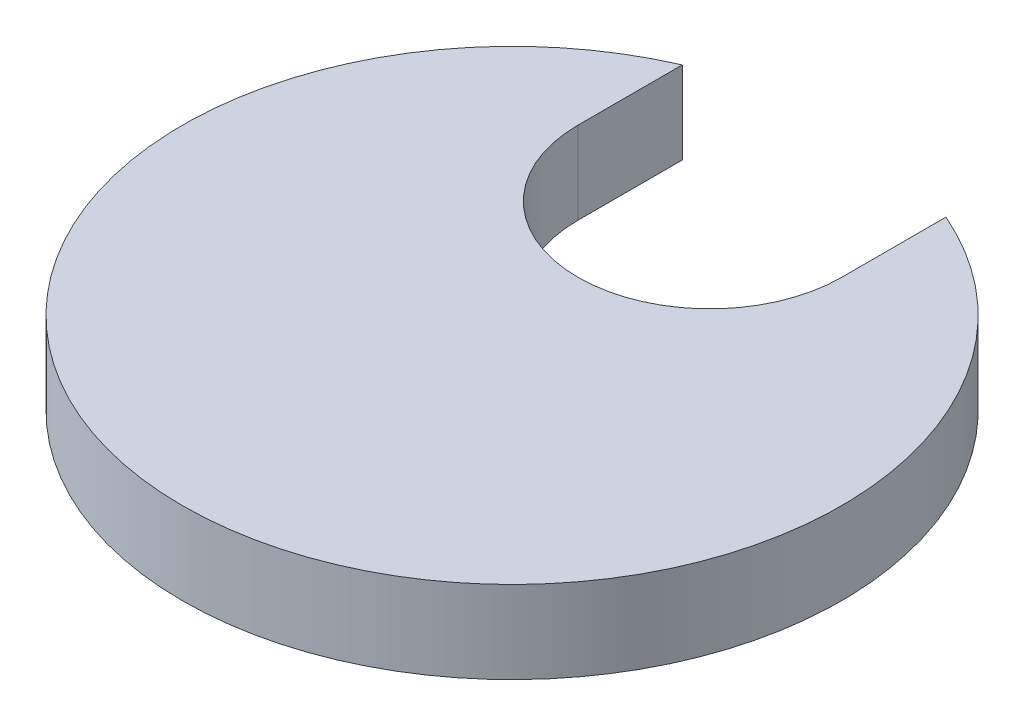
ISO-10303-21;
HEADER;
FILE_DESCRIPTION(('STEP AP214'),'2;1');
FILE_NAME('part.step','',(''),(''),'','','');
FILE_SCHEMA(('AUTOMOTIVE_DESIGN { 1 0 10303 214 1 1 1 1 }'));
ENDSEC;
DATA;
#1=APPLICATION_CONTEXT('core data for automotive mechanical design processes');
#2=APPLICATION_PROTOCOL_DEFINITION('international standard','automotive_design',2000,#1);
#3=PRODUCT_CONTEXT('',#1,'mechanical');
#4=PRODUCT('Part','Part','',(#3));
#5=PRODUCT_RELATED_PRODUCT_CATEGORY('part','',(#4));
#6=PRODUCT_DEFINITION_FORMATION('','',#4);
#7=PRODUCT_DEFINITION_CONTEXT('part definition',#1,'design');
#8=PRODUCT_DEFINITION('design','',#6,#7);
#9=PRODUCT_DEFINITION_SHAPE('','',#8);
#10=(LENGTH_UNIT() NAMED_UNIT(*) SI_UNIT(.MILLI.,.METRE.));
#11=(NAMED_UNIT(*) PLANE_ANGLE_UNIT() SI_UNIT($,.RADIAN.));
#12=(NAMED_UNIT(*) SI_UNIT($,.STERADIAN.) SOLID_ANGLE_UNIT());
#13=UNCERTAINTY_MEASURE_WITH_UNIT(LENGTH_MEASURE(1.E-05),#10,'distance_accuracy_value','');
#14=(GEOMETRIC_REPRESENTATION_CONTEXT(3) GLOBAL_UNCERTAINTY_ASSIGNED_CONTEXT((#13)) GLOBAL_UNIT_ASSIGNED_CONTEXT((#10,
#11,#12)) REPRESENTATION_CONTEXT('',''));
#15=CARTESIAN_POINT('',(0.,0.,0.));
#16=DIRECTION('',(0.,0.,1.));
#17=DIRECTION('',(1.,0.,0.));
#18=AXIS2_PLACEMENT_3D('',#15,#16,#17);
#19=CARTESIAN_POINT('',(0.,2.5,-6.));
#20=DIRECTION('',(0.,-1.,0.));
#21=DIRECTION('',(0.,0.,-1.));
#22=AXIS2_PLACEMENT_3D('',#19,#20,#21);
#23=CYLINDRICAL_SURFACE('',#22,4.);
#24=CARTESIAN_POINT('',(0.,0.,-6.));
#25=DIRECTION('',(0.,1.,0.));
#26=DIRECTION('',(0.,0.,1.));
#27=AXIS2_PLACEMENT_3D('',#24,#25,#26);
#28=CIRCLE('',#27,4.);
#29=CARTESIAN_POINT('',(-4.,0.,-6.));
#30=VERTEX_POINT('',#29);
#31=CARTESIAN_POINT('',(4.,0.,-6.));
#32=VERTEX_POINT('',#31);
#33=EDGE_CURVE('E99',#30,#32,#28,.T.);
#34=ORIENTED_EDGE('',*,*,#33,.F.);
#35=DIRECTION('',(0.,-1.,0.));
#36=VECTOR('',#35,1.);
#37=CARTESIAN_POINT('',(-4.,2.5,-6.));
#38=LINE('',#37,#36);
#39=CARTESIAN_POINT('',(-4.,2.5,-6.));
#40=VERTEX_POINT('',#39);
#41=EDGE_CURVE('E11',#40,#30,#38,.T.);
#42=ORIENTED_EDGE('',*,*,#41,.F.);
#43=CARTESIAN_POINT('',(0.,2.5,-6.));
#44=DIRECTION('',(0.,1.,0.));
#45=DIRECTION('',(0.,0.,1.));
#46=AXIS2_PLACEMENT_3D('',#43,#44,#45);
#47=CIRCLE('',#46,4.);
#48=CARTESIAN_POINT('',(4.,2.5,-6.));
#49=VERTEX_POINT('',#48);
#50=EDGE_CURVE('E84',#40,#49,#47,.T.);
#51=ORIENTED_EDGE('',*,*,#50,.T.);
#52=DIRECTION('',(0.,-1.,0.));
#53=VECTOR('',#52,1.);
#54=CARTESIAN_POINT('',(4.,2.5,-6.));
#55=LINE('',#54,#53);
#56=EDGE_CURVE('E52',#49,#32,#55,.T.);
#57=ORIENTED_EDGE('',*,*,#56,.T.);
#58=EDGE_LOOP('',(#34,#42,#51,#57));
#59=FACE_BOUND('',#58,.T.);
#60=ADVANCED_FACE('F36',(#59),#23,.F.);
#61=CARTESIAN_POINT('',(-4.,2.5,0.));
#62=DIRECTION('',(-1.,0.,0.));
#63=DIRECTION('',(0.,0.,1.));
#64=AXIS2_PLACEMENT_3D('',#61,#62,#63);
#65=PLANE('',#64);
#66=DIRECTION('',(0.,0.,-1.));
#67=VECTOR('',#66,1.);
#68=CARTESIAN_POINT('',(-4.,0.,0.));
#69=LINE('',#68,#67);
#70=CARTESIAN_POINT('',(-4.,0.,-9.16515138991168));
#71=VERTEX_POINT('',#70);
#72=EDGE_CURVE('E90',#30,#71,#69,.T.);
#73=ORIENTED_EDGE('',*,*,#72,.T.);
#74=DIRECTION('',(0.,-1.,0.));
#75=VECTOR('',#74,1.);
#76=CARTESIAN_POINT('',(-4.,2.5,-9.16515138991168));
#77=LINE('',#76,#75);
#78=CARTESIAN_POINT('',(-4.,2.5,-9.16515138991168));
#79=VERTEX_POINT('',#78);
#80=EDGE_CURVE('E44',#79,#71,#77,.T.);
#81=ORIENTED_EDGE('',*,*,#80,.F.);
#82=DIRECTION('',(0.,0.,-1.));
#83=VECTOR('',#82,1.);
#84=CARTESIAN_POINT('',(-4.,2.5,0.));
#85=LINE('',#84,#83);
#86=EDGE_CURVE('E78',#40,#79,#85,.T.);
#87=ORIENTED_EDGE('',*,*,#86,.F.);
#88=ORIENTED_EDGE('',*,*,#41,.T.);
#89=EDGE_LOOP('',(#73,#81,#87,#88));
#90=FACE_BOUND('',#89,.T.);
#91=ADVANCED_FACE('F88',(#90),#65,.F.);
#92=CARTESIAN_POINT('',(0.,2.5,0.));
#93=DIRECTION('',(0.,-1.,0.));
#94=DIRECTION('',(0.,0.,-1.));
#95=AXIS2_PLACEMENT_3D('',#92,#93,#94);
#96=CYLINDRICAL_SURFACE('',#95,10.);
#97=CARTESIAN_POINT('',(0.,0.,0.));
#98=DIRECTION('',(0.,1.,0.));
#99=DIRECTION('',(0.,0.,1.));
#100=AXIS2_PLACEMENT_3D('',#97,#98,#99);
#101=CIRCLE('',#100,10.);
#102=CARTESIAN_POINT('',(4.,0.,-9.16515138991168));
#103=VERTEX_POINT('',#102);
#104=EDGE_CURVE('E102',#71,#103,#101,.T.);
#105=ORIENTED_EDGE('',*,*,#104,.T.);
#106=DIRECTION('',(0.,-1.,0.));
#107=VECTOR('',#106,1.);
#108=CARTESIAN_POINT('',(4.,2.5,-9.16515138991168));
#109=LINE('',#108,#107);
#110=CARTESIAN_POINT('',(4.,2.5,-9.16515138991168));
#111=VERTEX_POINT('',#110);
#112=EDGE_CURVE('E66',#111,#103,#109,.T.);
#113=ORIENTED_EDGE('',*,*,#112,.F.);
#114=CARTESIAN_POINT('',(0.,2.5,0.));
#115=DIRECTION('',(0.,1.,0.));
#116=DIRECTION('',(0.,0.,1.));
#117=AXIS2_PLACEMENT_3D('',#114,#115,#116);
#118=CIRCLE('',#117,10.);
#119=EDGE_CURVE('E83',#79,#111,#118,.T.);
#120=ORIENTED_EDGE('',*,*,#119,.F.);
#121=ORIENTED_EDGE('',*,*,#80,.T.);
#122=EDGE_LOOP('',(#105,#113,#120,#121));
#123=FACE_BOUND('',#122,.T.);
#124=ADVANCED_FACE('F93',(#123),#96,.T.);
#125=CARTESIAN_POINT('',(4.,2.5,0.));
#126=DIRECTION('',(-1.,0.,0.));
#127=DIRECTION('',(0.,0.,1.));
#128=AXIS2_PLACEMENT_3D('',#125,#126,#127);
#129=PLANE('',#128);
#130=DIRECTION('',(0.,0.,-1.));
#131=VECTOR('',#130,1.);
#132=CARTESIAN_POINT('',(4.,0.,0.));
#133=LINE('',#132,#131);
#134=EDGE_CURVE('E104',#32,#103,#133,.T.);
#135=ORIENTED_EDGE('',*,*,#134,.F.);
#136=ORIENTED_EDGE('',*,*,#56,.F.);
#137=DIRECTION('',(0.,0.,-1.));
#138=VECTOR('',#137,1.);
#139=CARTESIAN_POINT('',(4.,2.5,0.));
#140=LINE('',#139,#138);
#141=EDGE_CURVE('E94',#49,#111,#140,.T.);
#142=ORIENTED_EDGE('',*,*,#141,.T.);
#143=ORIENTED_EDGE('',*,*,#112,.T.);
#144=EDGE_LOOP('',(#135,#136,#142,#143));
#145=FACE_BOUND('',#144,.T.);
#146=ADVANCED_FACE('F109',(#145),#129,.T.);
#147=CARTESIAN_POINT('',(0.,2.5,0.));
#148=DIRECTION('',(0.,1.,0.));
#149=DIRECTION('',(0.,0.,1.));
#150=AXIS2_PLACEMENT_3D('',#147,#148,#149);
#151=PLANE('',#150);
#152=ORIENTED_EDGE('',*,*,#50,.F.);
#153=ORIENTED_EDGE('',*,*,#86,.T.);
#154=ORIENTED_EDGE('',*,*,#119,.T.);
#155=ORIENTED_EDGE('',*,*,#141,.F.);
#156=EDGE_LOOP('',(#152,#153,#154,#155));
#157=FACE_BOUND('',#156,.T.);
#158=ADVANCED_FACE('F80',(#157),#151,.T.);
#159=CARTESIAN_POINT('',(0.,0.,0.));
#160=DIRECTION('',(0.,1.,0.));
#161=DIRECTION('',(0.,0.,1.));
#162=AXIS2_PLACEMENT_3D('',#159,#160,#161);
#163=PLANE('',#162);
#164=ORIENTED_EDGE('',*,*,#33,.T.);
#165=ORIENTED_EDGE('',*,*,#134,.T.);
#166=ORIENTED_EDGE('',*,*,#104,.F.);
#167=ORIENTED_EDGE('',*,*,#72,.F.);
#168=EDGE_LOOP('',(#164,#165,#166,#167));
#169=FACE_BOUND('',#168,.T.);
#170=ADVANCED_FACE('F116',(#169),#163,.F.);
#171=CLOSED_SHELL('',(#60,#91,#124,#146,#158,#170));
#172=MANIFOLD_SOLID_BREP('B2',#171);
#173=ADVANCED_BREP_SHAPE_REPRESENTATION('',(#18,#172),#14);
#174=SHAPE_DEFINITION_REPRESENTATION(#9,#173);
ENDSEC;
END-ISO-10303-21;
